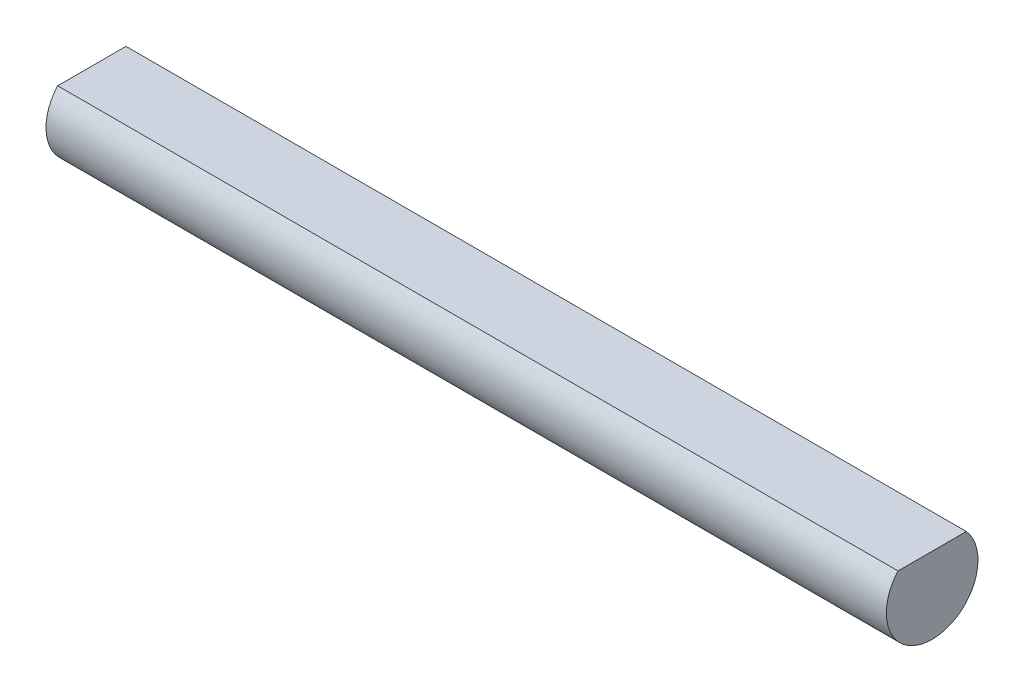
ISO-10303-21;
HEADER;
FILE_DESCRIPTION(('STEP AP214'),'2;1');
FILE_NAME('part.step','',(''),(''),'','','');
FILE_SCHEMA(('AUTOMOTIVE_DESIGN { 1 0 10303 214 1 1 1 1 }'));
ENDSEC;
DATA;
#1=APPLICATION_CONTEXT('core data for automotive mechanical design processes');
#2=APPLICATION_PROTOCOL_DEFINITION('international standard','automotive_design',2000,#1);
#3=PRODUCT_CONTEXT('',#1,'mechanical');
#4=PRODUCT('Part','Part','',(#3));
#5=PRODUCT_RELATED_PRODUCT_CATEGORY('part','',(#4));
#6=PRODUCT_DEFINITION_FORMATION('','',#4);
#7=PRODUCT_DEFINITION_CONTEXT('part definition',#1,'design');
#8=PRODUCT_DEFINITION('design','',#6,#7);
#9=PRODUCT_DEFINITION_SHAPE('','',#8);
#10=(LENGTH_UNIT() NAMED_UNIT(*) SI_UNIT(.MILLI.,.METRE.));
#11=(NAMED_UNIT(*) PLANE_ANGLE_UNIT() SI_UNIT($,.RADIAN.));
#12=(NAMED_UNIT(*) SI_UNIT($,.STERADIAN.) SOLID_ANGLE_UNIT());
#13=UNCERTAINTY_MEASURE_WITH_UNIT(LENGTH_MEASURE(1.E-05),#10,'distance_accuracy_value','');
#14=(GEOMETRIC_REPRESENTATION_CONTEXT(3) GLOBAL_UNCERTAINTY_ASSIGNED_CONTEXT((#13)) GLOBAL_UNIT_ASSIGNED_CONTEXT((#10,
#11,#12)) REPRESENTATION_CONTEXT('',''));
#15=CARTESIAN_POINT('',(0.,0.,0.));
#16=DIRECTION('',(0.,0.,1.));
#17=DIRECTION('',(1.,0.,0.));
#18=AXIS2_PLACEMENT_3D('',#15,#16,#17);
#19=CARTESIAN_POINT('',(27.5,0.,0.));
#20=DIRECTION('',(-1.,0.,0.));
#21=DIRECTION('',(0.,0.,1.));
#22=AXIS2_PLACEMENT_3D('',#19,#20,#21);
#23=CYLINDRICAL_SURFACE('',#22,3.);
#24=CARTESIAN_POINT('',(-27.5,0.,0.));
#25=DIRECTION('',(1.,0.,0.));
#26=DIRECTION('',(0.,0.,-1.));
#27=AXIS2_PLACEMENT_3D('',#24,#25,#26);
#28=CIRCLE('',#27,3.);
#29=CARTESIAN_POINT('',(-27.5,2.,2.23606797749979));
#30=VERTEX_POINT('',#29);
#31=CARTESIAN_POINT('',(-27.5,2.,-2.23606797749979));
#32=VERTEX_POINT('',#31);
#33=EDGE_CURVE('E56',#30,#32,#28,.T.);
#34=ORIENTED_EDGE('',*,*,#33,.T.);
#35=DIRECTION('',(-1.,0.,0.));
#36=VECTOR('',#35,1.);
#37=CARTESIAN_POINT('',(27.5,2.,-2.23606797749979));
#38=LINE('',#37,#36);
#39=CARTESIAN_POINT('',(27.5,2.,-2.23606797749979));
#40=VERTEX_POINT('',#39);
#41=EDGE_CURVE('E11',#40,#32,#38,.T.);
#42=ORIENTED_EDGE('',*,*,#41,.F.);
#43=CARTESIAN_POINT('',(27.5,0.,0.));
#44=DIRECTION('',(1.,0.,0.));
#45=DIRECTION('',(0.,0.,-1.));
#46=AXIS2_PLACEMENT_3D('',#43,#44,#45);
#47=CIRCLE('',#46,3.);
#48=CARTESIAN_POINT('',(27.5,2.,2.23606797749979));
#49=VERTEX_POINT('',#48);
#50=EDGE_CURVE('E58',#49,#40,#47,.T.);
#51=ORIENTED_EDGE('',*,*,#50,.F.);
#52=DIRECTION('',(-1.,0.,0.));
#53=VECTOR('',#52,1.);
#54=CARTESIAN_POINT('',(27.5,2.,2.23606797749979));
#55=LINE('',#54,#53);
#56=EDGE_CURVE('E40',#49,#30,#55,.T.);
#57=ORIENTED_EDGE('',*,*,#56,.T.);
#58=EDGE_LOOP('',(#34,#42,#51,#57));
#59=FACE_BOUND('',#58,.T.);
#60=ADVANCED_FACE('F32',(#59),#23,.T.);
#61=CARTESIAN_POINT('',(27.5,2.,2.23606797749979));
#62=DIRECTION('',(0.,1.,0.));
#63=DIRECTION('',(0.,0.,1.));
#64=AXIS2_PLACEMENT_3D('',#61,#62,#63);
#65=PLANE('',#64);
#66=DIRECTION('',(0.,0.,-1.));
#67=VECTOR('',#66,1.);
#68=CARTESIAN_POINT('',(-27.5,2.,2.23606797749979));
#69=LINE('',#68,#67);
#70=EDGE_CURVE('E63',#30,#32,#69,.T.);
#71=ORIENTED_EDGE('',*,*,#70,.F.);
#72=ORIENTED_EDGE('',*,*,#56,.F.);
#73=DIRECTION('',(0.,0.,-1.));
#74=VECTOR('',#73,1.);
#75=CARTESIAN_POINT('',(27.5,2.,2.23606797749979));
#76=LINE('',#75,#74);
#77=EDGE_CURVE('E60',#49,#40,#76,.T.);
#78=ORIENTED_EDGE('',*,*,#77,.T.);
#79=ORIENTED_EDGE('',*,*,#41,.T.);
#80=EDGE_LOOP('',(#71,#72,#78,#79));
#81=FACE_BOUND('',#80,.T.);
#82=ADVANCED_FACE('F65',(#81),#65,.T.);
#83=CARTESIAN_POINT('',(27.5,0.,0.));
#84=DIRECTION('',(1.,0.,0.));
#85=DIRECTION('',(0.,0.,-1.));
#86=AXIS2_PLACEMENT_3D('',#83,#84,#85);
#87=PLANE('',#86);
#88=ORIENTED_EDGE('',*,*,#50,.T.);
#89=ORIENTED_EDGE('',*,*,#77,.F.);
#90=EDGE_LOOP('',(#88,#89));
#91=FACE_BOUND('',#90,.T.);
#92=ADVANCED_FACE('F70',(#91),#87,.T.);
#93=CARTESIAN_POINT('',(-27.5,0.,0.));
#94=DIRECTION('',(1.,0.,0.));
#95=DIRECTION('',(0.,0.,-1.));
#96=AXIS2_PLACEMENT_3D('',#93,#94,#95);
#97=PLANE('',#96);
#98=ORIENTED_EDGE('',*,*,#33,.F.);
#99=ORIENTED_EDGE('',*,*,#70,.T.);
#100=EDGE_LOOP('',(#98,#99));
#101=FACE_BOUND('',#100,.T.);
#102=ADVANCED_FACE('F62',(#101),#97,.F.);
#103=CLOSED_SHELL('',(#60,#82,#92,#102));
#104=MANIFOLD_SOLID_BREP('B2',#103);
#105=ADVANCED_BREP_SHAPE_REPRESENTATION('',(#18,#104),#14);
#106=SHAPE_DEFINITION_REPRESENTATION(#9,#105);
ENDSEC;
END-ISO-10303-21;
